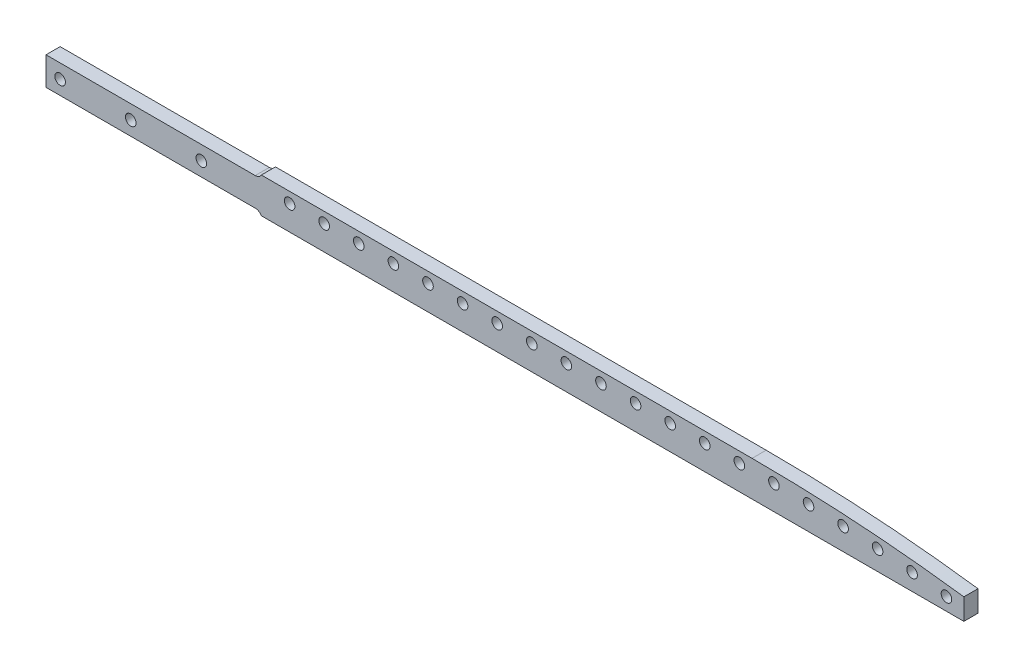
ISO-10303-21;
HEADER;
FILE_DESCRIPTION(('STEP AP214'),'2;1');
FILE_NAME('part.step','',(''),(''),'','','');
FILE_SCHEMA(('AUTOMOTIVE_DESIGN { 1 0 10303 214 1 1 1 1 }'));
ENDSEC;
DATA;
#1=APPLICATION_CONTEXT('core data for automotive mechanical design processes');
#2=APPLICATION_PROTOCOL_DEFINITION('international standard','automotive_design',2000,#1);
#3=PRODUCT_CONTEXT('',#1,'mechanical');
#4=PRODUCT('Part','Part','',(#3));
#5=PRODUCT_RELATED_PRODUCT_CATEGORY('part','',(#4));
#6=PRODUCT_DEFINITION_FORMATION('','',#4);
#7=PRODUCT_DEFINITION_CONTEXT('part definition',#1,'design');
#8=PRODUCT_DEFINITION('design','',#6,#7);
#9=PRODUCT_DEFINITION_SHAPE('','',#8);
#10=(LENGTH_UNIT() NAMED_UNIT(*) SI_UNIT(.MILLI.,.METRE.));
#11=(NAMED_UNIT(*) PLANE_ANGLE_UNIT() SI_UNIT($,.RADIAN.));
#12=(NAMED_UNIT(*) SI_UNIT($,.STERADIAN.) SOLID_ANGLE_UNIT());
#13=UNCERTAINTY_MEASURE_WITH_UNIT(LENGTH_MEASURE(1.E-05),#10,'distance_accuracy_value','');
#14=(GEOMETRIC_REPRESENTATION_CONTEXT(3) GLOBAL_UNCERTAINTY_ASSIGNED_CONTEXT((#13)) GLOBAL_UNIT_ASSIGNED_CONTEXT((#10,
#11,#12)) REPRESENTATION_CONTEXT('',''));
#15=CARTESIAN_POINT('',(0.,0.,0.));
#16=DIRECTION('',(0.,0.,1.));
#17=DIRECTION('',(1.,0.,0.));
#18=AXIS2_PLACEMENT_3D('',#15,#16,#17);
#19=CARTESIAN_POINT('',(-130.,-5.,4.));
#20=DIRECTION('',(1.,0.,0.));
#21=DIRECTION('',(0.,0.,-1.));
#22=AXIS2_PLACEMENT_3D('',#19,#20,#21);
#23=PLANE('',#22);
#24=DIRECTION('',(0.,0.,-1.));
#25=VECTOR('',#24,1.);
#26=CARTESIAN_POINT('',(-130.,-4.00000000000001,4.));
#27=LINE('',#26,#25);
#28=CARTESIAN_POINT('',(-130.,-4.00000000000001,4.));
#29=VERTEX_POINT('',#28);
#30=CARTESIAN_POINT('',(-130.,-4.00000000000001,0.));
#31=VERTEX_POINT('',#30);
#32=EDGE_CURVE('E212',#29,#31,#27,.T.);
#33=ORIENTED_EDGE('',*,*,#32,.F.);
#34=DIRECTION('',(0.,-1.,0.));
#35=VECTOR('',#34,1.);
#36=CARTESIAN_POINT('',(-130.,-5.,4.));
#37=LINE('',#36,#35);
#38=CARTESIAN_POINT('',(-130.,4.00000000000001,4.));
#39=VERTEX_POINT('',#38);
#40=EDGE_CURVE('E159',#39,#29,#37,.T.);
#41=ORIENTED_EDGE('',*,*,#40,.F.);
#42=DIRECTION('',(0.,0.,-1.));
#43=VECTOR('',#42,1.);
#44=CARTESIAN_POINT('',(-130.,4.00000000000001,4.));
#45=LINE('',#44,#43);
#46=CARTESIAN_POINT('',(-130.,4.00000000000001,0.));
#47=VERTEX_POINT('',#46);
#48=EDGE_CURVE('E198',#39,#47,#45,.T.);
#49=ORIENTED_EDGE('',*,*,#48,.T.);
#50=DIRECTION('',(0.,-1.,0.));
#51=VECTOR('',#50,1.);
#52=CARTESIAN_POINT('',(-130.,-5.,0.));
#53=LINE('',#52,#51);
#54=EDGE_CURVE('E175',#47,#31,#53,.T.);
#55=ORIENTED_EDGE('',*,*,#54,.T.);
#56=EDGE_LOOP('',(#33,#41,#49,#55));
#57=FACE_BOUND('',#56,.T.);
#58=ADVANCED_FACE('F68',(#57),#23,.F.);
#59=CARTESIAN_POINT('',(-130.,-5.,4.));
#60=DIRECTION('',(0.,1.,0.));
#61=DIRECTION('',(0.,0.,1.));
#62=AXIS2_PLACEMENT_3D('',#59,#60,#61);
#63=PLANE('',#62);
#64=DIRECTION('',(0.,0.,1.));
#65=VECTOR('',#64,1.);
#66=CARTESIAN_POINT('',(-69.,-5.,4.));
#67=LINE('',#66,#65);
#68=CARTESIAN_POINT('',(-69.,-5.,0.));
#69=VERTEX_POINT('',#68);
#70=CARTESIAN_POINT('',(-69.,-5.,4.));
#71=VERTEX_POINT('',#70);
#72=EDGE_CURVE('E199',#69,#71,#67,.T.);
#73=ORIENTED_EDGE('',*,*,#72,.F.);
#74=DIRECTION('',(1.,0.,0.));
#75=VECTOR('',#74,1.);
#76=CARTESIAN_POINT('',(-130.,-5.,0.));
#77=LINE('',#76,#75);
#78=CARTESIAN_POINT('',(130.,-5.,0.));
#79=VERTEX_POINT('',#78);
#80=EDGE_CURVE('E164',#69,#79,#77,.T.);
#81=ORIENTED_EDGE('',*,*,#80,.T.);
#82=DIRECTION('',(0.,0.,-1.));
#83=VECTOR('',#82,1.);
#84=CARTESIAN_POINT('',(130.,-5.,4.));
#85=LINE('',#84,#83);
#86=CARTESIAN_POINT('',(130.,-5.,4.));
#87=VERTEX_POINT('',#86);
#88=EDGE_CURVE('E169',#87,#79,#85,.T.);
#89=ORIENTED_EDGE('',*,*,#88,.F.);
#90=DIRECTION('',(1.,0.,0.));
#91=VECTOR('',#90,1.);
#92=CARTESIAN_POINT('',(-130.,-5.,4.));
#93=LINE('',#92,#91);
#94=EDGE_CURVE('E162',#71,#87,#93,.T.);
#95=ORIENTED_EDGE('',*,*,#94,.F.);
#96=EDGE_LOOP('',(#73,#81,#89,#95));
#97=FACE_BOUND('',#96,.T.);
#98=ADVANCED_FACE('F364',(#97),#63,.F.);
#99=CARTESIAN_POINT('',(0.,0.,4.));
#100=DIRECTION('',(0.,0.,-1.));
#101=DIRECTION('',(-1.,0.,0.));
#102=AXIS2_PLACEMENT_3D('',#99,#100,#101);
#103=PLANE('',#102);
#104=CARTESIAN_POINT('',(-51.2,2.,4.00000000000002));
#105=DIRECTION('',(0.,0.,1.));
#106=DIRECTION('',(1.,0.,0.));
#107=AXIS2_PLACEMENT_3D('',#104,#105,#106);
#108=CIRCLE('',#107,1.5);
#109=CARTESIAN_POINT('',(-49.7,2.,4.00000000000002));
#110=VERTEX_POINT('',#109);
#111=EDGE_CURVE('E351',#110,#110,#108,.T.);
#112=ORIENTED_EDGE('',*,*,#111,.F.);
#113=EDGE_LOOP('',(#112));
#114=FACE_BOUND('',#113,.T.);
#115=CARTESIAN_POINT('',(-41.4,2.,4.00000000000002));
#116=DIRECTION('',(0.,0.,1.));
#117=DIRECTION('',(1.,0.,0.));
#118=AXIS2_PLACEMENT_3D('',#115,#116,#117);
#119=CIRCLE('',#118,1.5);
#120=CARTESIAN_POINT('',(-39.9,2.,4.00000000000002));
#121=VERTEX_POINT('',#120);
#122=EDGE_CURVE('E345',#121,#121,#119,.T.);
#123=ORIENTED_EDGE('',*,*,#122,.F.);
#124=EDGE_LOOP('',(#123));
#125=FACE_BOUND('',#124,.T.);
#126=CARTESIAN_POINT('',(-31.6,2.,4.00000000000002));
#127=DIRECTION('',(0.,0.,1.));
#128=DIRECTION('',(1.,0.,0.));
#129=AXIS2_PLACEMENT_3D('',#126,#127,#128);
#130=CIRCLE('',#129,1.5);
#131=CARTESIAN_POINT('',(-30.1,2.,4.00000000000002));
#132=VERTEX_POINT('',#131);
#133=EDGE_CURVE('E339',#132,#132,#130,.T.);
#134=ORIENTED_EDGE('',*,*,#133,.F.);
#135=EDGE_LOOP('',(#134));
#136=FACE_BOUND('',#135,.T.);
#137=CARTESIAN_POINT('',(-21.8,2.,4.00000000000002));
#138=DIRECTION('',(0.,0.,1.));
#139=DIRECTION('',(1.,0.,0.));
#140=AXIS2_PLACEMENT_3D('',#137,#138,#139);
#141=CIRCLE('',#140,1.5);
#142=CARTESIAN_POINT('',(-20.3,2.,4.00000000000002));
#143=VERTEX_POINT('',#142);
#144=EDGE_CURVE('E333',#143,#143,#141,.T.);
#145=ORIENTED_EDGE('',*,*,#144,.F.);
#146=EDGE_LOOP('',(#145));
#147=FACE_BOUND('',#146,.T.);
#148=CARTESIAN_POINT('',(-12.,2.,4.00000000000002));
#149=DIRECTION('',(0.,0.,1.));
#150=DIRECTION('',(1.,0.,0.));
#151=AXIS2_PLACEMENT_3D('',#148,#149,#150);
#152=CIRCLE('',#151,1.5);
#153=CARTESIAN_POINT('',(-10.5,2.,4.00000000000002));
#154=VERTEX_POINT('',#153);
#155=EDGE_CURVE('E327',#154,#154,#152,.T.);
#156=ORIENTED_EDGE('',*,*,#155,.F.);
#157=EDGE_LOOP('',(#156));
#158=FACE_BOUND('',#157,.T.);
#159=CARTESIAN_POINT('',(-2.2,2.,4.00000000000002));
#160=DIRECTION('',(0.,0.,1.));
#161=DIRECTION('',(1.,0.,0.));
#162=AXIS2_PLACEMENT_3D('',#159,#160,#161);
#163=CIRCLE('',#162,1.5);
#164=CARTESIAN_POINT('',(-0.700000000000004,2.,4.00000000000002));
#165=VERTEX_POINT('',#164);
#166=EDGE_CURVE('E321',#165,#165,#163,.T.);
#167=ORIENTED_EDGE('',*,*,#166,.F.);
#168=EDGE_LOOP('',(#167));
#169=FACE_BOUND('',#168,.T.);
#170=CARTESIAN_POINT('',(7.6,2.,4.00000000000002));
#171=DIRECTION('',(0.,0.,1.));
#172=DIRECTION('',(1.,0.,0.));
#173=AXIS2_PLACEMENT_3D('',#170,#171,#172);
#174=CIRCLE('',#173,1.5);
#175=CARTESIAN_POINT('',(9.1,2.,4.00000000000002));
#176=VERTEX_POINT('',#175);
#177=EDGE_CURVE('E315',#176,#176,#174,.T.);
#178=ORIENTED_EDGE('',*,*,#177,.F.);
#179=EDGE_LOOP('',(#178));
#180=FACE_BOUND('',#179,.T.);
#181=CARTESIAN_POINT('',(17.4,2.,4.00000000000002));
#182=DIRECTION('',(0.,0.,1.));
#183=DIRECTION('',(1.,0.,0.));
#184=AXIS2_PLACEMENT_3D('',#181,#182,#183);
#185=CIRCLE('',#184,1.5);
#186=CARTESIAN_POINT('',(18.9,2.,4.00000000000002));
#187=VERTEX_POINT('',#186);
#188=EDGE_CURVE('E309',#187,#187,#185,.T.);
#189=ORIENTED_EDGE('',*,*,#188,.F.);
#190=EDGE_LOOP('',(#189));
#191=FACE_BOUND('',#190,.T.);
#192=CARTESIAN_POINT('',(27.2,2.,4.00000000000002));
#193=DIRECTION('',(0.,0.,1.));
#194=DIRECTION('',(1.,0.,0.));
#195=AXIS2_PLACEMENT_3D('',#192,#193,#194);
#196=CIRCLE('',#195,1.5);
#197=CARTESIAN_POINT('',(28.7,2.,4.00000000000002));
#198=VERTEX_POINT('',#197);
#199=EDGE_CURVE('E303',#198,#198,#196,.T.);
#200=ORIENTED_EDGE('',*,*,#199,.F.);
#201=EDGE_LOOP('',(#200));
#202=FACE_BOUND('',#201,.T.);
#203=CARTESIAN_POINT('',(37.,2.,4.00000000000002));
#204=DIRECTION('',(0.,0.,1.));
#205=DIRECTION('',(1.,0.,0.));
#206=AXIS2_PLACEMENT_3D('',#203,#204,#205);
#207=CIRCLE('',#206,1.5);
#208=CARTESIAN_POINT('',(38.5,2.,4.00000000000002));
#209=VERTEX_POINT('',#208);
#210=EDGE_CURVE('E297',#209,#209,#207,.T.);
#211=ORIENTED_EDGE('',*,*,#210,.F.);
#212=EDGE_LOOP('',(#211));
#213=FACE_BOUND('',#212,.T.);
#214=CARTESIAN_POINT('',(46.8,2.,4.00000000000002));
#215=DIRECTION('',(0.,0.,1.));
#216=DIRECTION('',(1.,0.,0.));
#217=AXIS2_PLACEMENT_3D('',#214,#215,#216);
#218=CIRCLE('',#217,1.5);
#219=CARTESIAN_POINT('',(48.3,2.,4.00000000000002));
#220=VERTEX_POINT('',#219);
#221=EDGE_CURVE('E291',#220,#220,#218,.T.);
#222=ORIENTED_EDGE('',*,*,#221,.F.);
#223=EDGE_LOOP('',(#222));
#224=FACE_BOUND('',#223,.T.);
#225=CARTESIAN_POINT('',(56.6,2.,4.00000000000002));
#226=DIRECTION('',(0.,0.,1.));
#227=DIRECTION('',(1.,0.,0.));
#228=AXIS2_PLACEMENT_3D('',#225,#226,#227);
#229=CIRCLE('',#228,1.5);
#230=CARTESIAN_POINT('',(58.1,2.,4.00000000000002));
#231=VERTEX_POINT('',#230);
#232=EDGE_CURVE('E285',#231,#231,#229,.T.);
#233=ORIENTED_EDGE('',*,*,#232,.F.);
#234=EDGE_LOOP('',(#233));
#235=FACE_BOUND('',#234,.T.);
#236=CARTESIAN_POINT('',(66.4,2.,4.00000000000002));
#237=DIRECTION('',(0.,0.,1.));
#238=DIRECTION('',(1.,0.,0.));
#239=AXIS2_PLACEMENT_3D('',#236,#237,#238);
#240=CIRCLE('',#239,1.5);
#241=CARTESIAN_POINT('',(67.9,2.,4.00000000000002));
#242=VERTEX_POINT('',#241);
#243=EDGE_CURVE('E279',#242,#242,#240,.T.);
#244=ORIENTED_EDGE('',*,*,#243,.F.);
#245=EDGE_LOOP('',(#244));
#246=FACE_BOUND('',#245,.T.);
#247=CARTESIAN_POINT('',(76.1998055791387,1.95747854281703,4.00000000000002));
#248=DIRECTION('',(0.,0.,1.));
#249=DIRECTION('',(1.,0.,0.));
#250=AXIS2_PLACEMENT_3D('',#247,#248,#249);
#251=CIRCLE('',#250,1.5);
#252=CARTESIAN_POINT('',(77.6998055791387,1.95747854281703,4.00000000000002));
#253=VERTEX_POINT('',#252);
#254=EDGE_CURVE('E273',#253,#253,#251,.T.);
#255=ORIENTED_EDGE('',*,*,#254,.F.);
#256=EDGE_LOOP('',(#255));
#257=FACE_BOUND('',#256,.T.);
#258=CARTESIAN_POINT('',(85.9966587834908,1.71684372819725,4.00000000000002));
#259=DIRECTION('',(0.,0.,1.));
#260=DIRECTION('',(1.,0.,0.));
#261=AXIS2_PLACEMENT_3D('',#258,#259,#260);
#262=CIRCLE('',#261,1.5);
#263=CARTESIAN_POINT('',(87.4966587834908,1.71684372819725,4.00000000000002));
#264=VERTEX_POINT('',#263);
#265=EDGE_CURVE('E267',#264,#264,#262,.T.);
#266=ORIENTED_EDGE('',*,*,#265,.F.);
#267=EDGE_LOOP('',(#266));
#268=FACE_BOUND('',#267,.T.);
#269=CARTESIAN_POINT('',(95.7859925123198,1.26387246283582,4.00000000000002));
#270=DIRECTION('',(0.,0.,1.));
#271=DIRECTION('',(1.,0.,0.));
#272=AXIS2_PLACEMENT_3D('',#269,#270,#271);
#273=CIRCLE('',#272,1.5);
#274=CARTESIAN_POINT('',(97.2859925123198,1.26387246283582,4.00000000000002));
#275=VERTEX_POINT('',#274);
#276=EDGE_CURVE('E261',#275,#275,#273,.T.);
#277=ORIENTED_EDGE('',*,*,#276,.F.);
#278=EDGE_LOOP('',(#277));
#279=FACE_BOUND('',#278,.T.);
#280=CARTESIAN_POINT('',(105.563205138726,0.598777672843775,4.00000000000002));
#281=DIRECTION('',(0.,0.,1.));
#282=DIRECTION('',(1.,0.,0.));
#283=AXIS2_PLACEMENT_3D('',#280,#281,#282);
#284=CIRCLE('',#283,1.5);
#285=CARTESIAN_POINT('',(107.063205138726,0.598777672843775,4.00000000000002));
#286=VERTEX_POINT('',#285);
#287=EDGE_CURVE('E255',#286,#286,#284,.T.);
#288=ORIENTED_EDGE('',*,*,#287,.F.);
#289=EDGE_LOOP('',(#288));
#290=FACE_BOUND('',#289,.T.);
#291=CARTESIAN_POINT('',(115.323700733521,-0.278128003742439,4.00000000000002));
#292=DIRECTION('',(0.,0.,1.));
#293=DIRECTION('',(1.,0.,0.));
#294=AXIS2_PLACEMENT_3D('',#291,#292,#293);
#295=CIRCLE('',#294,1.5);
#296=CARTESIAN_POINT('',(116.823700733521,-0.278128003742439,4.00000000000002));
#297=VERTEX_POINT('',#296);
#298=EDGE_CURVE('E249',#297,#297,#295,.T.);
#299=ORIENTED_EDGE('',*,*,#298,.F.);
#300=EDGE_LOOP('',(#299));
#301=FACE_BOUND('',#300,.T.);
#302=CARTESIAN_POINT('',(125.062891225612,-1.36643236392081,4.00000000000002));
#303=DIRECTION('',(0.,0.,1.));
#304=DIRECTION('',(1.,0.,0.));
#305=AXIS2_PLACEMENT_3D('',#302,#303,#304);
#306=CIRCLE('',#305,1.5);
#307=CARTESIAN_POINT('',(126.562891225612,-1.36643236392081,4.00000000000002));
#308=VERTEX_POINT('',#307);
#309=EDGE_CURVE('E243',#308,#308,#306,.T.);
#310=ORIENTED_EDGE('',*,*,#309,.F.);
#311=EDGE_LOOP('',(#310));
#312=FACE_BOUND('',#311,.T.);
#313=CARTESIAN_POINT('',(-61.,2.,4.));
#314=DIRECTION('',(0.,0.,1.));
#315=DIRECTION('',(1.,0.,0.));
#316=AXIS2_PLACEMENT_3D('',#313,#314,#315);
#317=CIRCLE('',#316,1.5);
#318=CARTESIAN_POINT('',(-59.5,2.,4.));
#319=VERTEX_POINT('',#318);
#320=EDGE_CURVE('E237',#319,#319,#317,.T.);
#321=ORIENTED_EDGE('',*,*,#320,.F.);
#322=EDGE_LOOP('',(#321));
#323=FACE_BOUND('',#322,.T.);
#324=CARTESIAN_POINT('',(-126.,0.,4.));
#325=DIRECTION('',(0.,0.,1.));
#326=DIRECTION('',(1.,0.,0.));
#327=AXIS2_PLACEMENT_3D('',#324,#325,#326);
#328=CIRCLE('',#327,1.5);
#329=CARTESIAN_POINT('',(-124.5,0.,4.));
#330=VERTEX_POINT('',#329);
#331=EDGE_CURVE('E232',#330,#330,#328,.T.);
#332=ORIENTED_EDGE('',*,*,#331,.F.);
#333=EDGE_LOOP('',(#332));
#334=FACE_BOUND('',#333,.T.);
#335=CARTESIAN_POINT('',(-86.,0.,4.));
#336=DIRECTION('',(0.,0.,1.));
#337=DIRECTION('',(1.,0.,0.));
#338=AXIS2_PLACEMENT_3D('',#335,#336,#337);
#339=CIRCLE('',#338,1.5);
#340=CARTESIAN_POINT('',(-84.5,0.,4.));
#341=VERTEX_POINT('',#340);
#342=EDGE_CURVE('E226',#341,#341,#339,.T.);
#343=ORIENTED_EDGE('',*,*,#342,.F.);
#344=EDGE_LOOP('',(#343));
#345=FACE_BOUND('',#344,.T.);
#346=CARTESIAN_POINT('',(-106.,0.,4.));
#347=DIRECTION('',(0.,0.,1.));
#348=DIRECTION('',(1.,0.,0.));
#349=AXIS2_PLACEMENT_3D('',#346,#347,#348);
#350=CIRCLE('',#349,1.5);
#351=CARTESIAN_POINT('',(-104.5,0.,4.));
#352=VERTEX_POINT('',#351);
#353=EDGE_CURVE('E219',#352,#352,#350,.T.);
#354=ORIENTED_EDGE('',*,*,#353,.F.);
#355=EDGE_LOOP('',(#354));
#356=FACE_BOUND('',#355,.T.);
#357=DIRECTION('',(0.,1.,0.));
#358=VECTOR('',#357,1.);
#359=CARTESIAN_POINT('',(130.,-5.,4.));
#360=LINE('',#359,#358);
#361=CARTESIAN_POINT('',(130.,1.02660675396976,4.));
#362=VERTEX_POINT('',#361);
#363=EDGE_CURVE('E153',#87,#362,#360,.T.);
#364=ORIENTED_EDGE('',*,*,#363,.T.);
#365=CARTESIAN_POINT('',(70.,-450.,4.));
#366=DIRECTION('',(0.,0.,-1.));
#367=DIRECTION('',(1.,0.,0.));
#368=AXIS2_PLACEMENT_3D('',#365,#366,#367);
#369=CIRCLE('',#368,455.);
#370=CARTESIAN_POINT('',(69.9999999999999,5.,4.));
#371=VERTEX_POINT('',#370);
#372=EDGE_CURVE('E140',#371,#362,#369,.T.);
#373=ORIENTED_EDGE('',*,*,#372,.F.);
#374=DIRECTION('',(-1.,0.,0.));
#375=VECTOR('',#374,1.);
#376=CARTESIAN_POINT('',(-130.,5.,4.));
#377=LINE('',#376,#375);
#378=CARTESIAN_POINT('',(-69.,5.,4.));
#379=VERTEX_POINT('',#378);
#380=EDGE_CURVE('E150',#371,#379,#377,.T.);
#381=ORIENTED_EDGE('',*,*,#380,.T.);
#382=CARTESIAN_POINT('',(-70.7320508075689,6.00000000000002,4.));
#383=DIRECTION('',(0.,0.,-1.));
#384=DIRECTION('',(-1.,0.,0.));
#385=AXIS2_PLACEMENT_3D('',#382,#383,#384);
#386=CIRCLE('',#385,2.);
#387=CARTESIAN_POINT('',(-70.7320508075689,4.00000000000002,4.));
#388=VERTEX_POINT('',#387);
#389=EDGE_CURVE('E76',#379,#388,#386,.T.);
#390=ORIENTED_EDGE('',*,*,#389,.T.);
#391=DIRECTION('',(1.,0.,0.));
#392=VECTOR('',#391,1.);
#393=CARTESIAN_POINT('',(-191.,4.,4.));
#394=LINE('',#393,#392);
#395=EDGE_CURVE('E193',#39,#388,#394,.T.);
#396=ORIENTED_EDGE('',*,*,#395,.F.);
#397=ORIENTED_EDGE('',*,*,#40,.T.);
#398=DIRECTION('',(1.,0.,0.));
#399=VECTOR('',#398,1.);
#400=CARTESIAN_POINT('',(-191.,-4.,4.));
#401=LINE('',#400,#399);
#402=CARTESIAN_POINT('',(-70.7320508075689,-4.00000000000002,4.));
#403=VERTEX_POINT('',#402);
#404=EDGE_CURVE('E215',#29,#403,#401,.T.);
#405=ORIENTED_EDGE('',*,*,#404,.T.);
#406=CARTESIAN_POINT('',(-70.7320508075689,-6.00000000000002,4.));
#407=DIRECTION('',(0.,0.,-1.));
#408=DIRECTION('',(-1.,0.,0.));
#409=AXIS2_PLACEMENT_3D('',#406,#407,#408);
#410=CIRCLE('',#409,2.);
#411=EDGE_CURVE('E189',#403,#71,#410,.T.);
#412=ORIENTED_EDGE('',*,*,#411,.T.);
#413=ORIENTED_EDGE('',*,*,#94,.T.);
#414=EDGE_LOOP('',(#364,#373,#381,#390,#396,#397,#405,#412,#413));
#415=FACE_BOUND('',#414,.T.);
#416=ADVANCED_FACE('F149',(#114,#125,#136,#147,#158,#169,#180,#191,#202,#213,#224,#235,#246,
#257,#268,#279,#290,#301,#312,#323,#334,#345,#356,#415),#103,.F.);
#417=CARTESIAN_POINT('',(0.,0.,0.));
#418=DIRECTION('',(0.,0.,-1.));
#419=DIRECTION('',(-1.,0.,0.));
#420=AXIS2_PLACEMENT_3D('',#417,#418,#419);
#421=PLANE('',#420);
#422=CARTESIAN_POINT('',(70.,-450.,0.));
#423=DIRECTION('',(0.,0.,-1.));
#424=DIRECTION('',(1.,0.,0.));
#425=AXIS2_PLACEMENT_3D('',#422,#423,#424);
#426=CIRCLE('',#425,455.);
#427=CARTESIAN_POINT('',(69.9999999999999,5.,0.));
#428=VERTEX_POINT('',#427);
#429=CARTESIAN_POINT('',(130.,1.02660675396976,0.));
#430=VERTEX_POINT('',#429);
#431=EDGE_CURVE('E83',#428,#430,#426,.T.);
#432=ORIENTED_EDGE('',*,*,#431,.T.);
#433=DIRECTION('',(0.,1.,0.));
#434=VECTOR('',#433,1.);
#435=CARTESIAN_POINT('',(130.,-5.,0.));
#436=LINE('',#435,#434);
#437=EDGE_CURVE('E170',#79,#430,#436,.T.);
#438=ORIENTED_EDGE('',*,*,#437,.F.);
#439=ORIENTED_EDGE('',*,*,#80,.F.);
#440=CARTESIAN_POINT('',(-70.7320508075689,-6.00000000000002,0.));
#441=DIRECTION('',(0.,0.,-1.));
#442=DIRECTION('',(-1.,0.,0.));
#443=AXIS2_PLACEMENT_3D('',#440,#441,#442);
#444=CIRCLE('',#443,2.);
#445=CARTESIAN_POINT('',(-70.7320508075689,-4.00000000000002,0.));
#446=VERTEX_POINT('',#445);
#447=EDGE_CURVE('E191',#69,#446,#444,.F.);
#448=ORIENTED_EDGE('',*,*,#447,.T.);
#449=DIRECTION('',(-1.,0.,0.));
#450=VECTOR('',#449,1.);
#451=CARTESIAN_POINT('',(0.,-4.00000000000002,0.));
#452=LINE('',#451,#450);
#453=EDGE_CURVE('E183',#446,#31,#452,.T.);
#454=ORIENTED_EDGE('',*,*,#453,.T.);
#455=ORIENTED_EDGE('',*,*,#54,.F.);
#456=DIRECTION('',(-1.,0.,0.));
#457=VECTOR('',#456,1.);
#458=CARTESIAN_POINT('',(0.,4.00000000000002,0.));
#459=LINE('',#458,#457);
#460=CARTESIAN_POINT('',(-70.7320508075689,4.00000000000002,0.));
#461=VERTEX_POINT('',#460);
#462=EDGE_CURVE('E181',#461,#47,#459,.T.);
#463=ORIENTED_EDGE('',*,*,#462,.F.);
#464=CARTESIAN_POINT('',(-70.7320508075689,6.00000000000002,0.));
#465=DIRECTION('',(0.,0.,-1.));
#466=DIRECTION('',(-1.,0.,0.));
#467=AXIS2_PLACEMENT_3D('',#464,#465,#466);
#468=CIRCLE('',#467,2.);
#469=CARTESIAN_POINT('',(-69.,5.,0.));
#470=VERTEX_POINT('',#469);
#471=EDGE_CURVE('E13',#461,#470,#468,.F.);
#472=ORIENTED_EDGE('',*,*,#471,.T.);
#473=DIRECTION('',(-1.,0.,0.));
#474=VECTOR('',#473,1.);
#475=CARTESIAN_POINT('',(-130.,5.,0.));
#476=LINE('',#475,#474);
#477=EDGE_CURVE('E173',#428,#470,#476,.T.);
#478=ORIENTED_EDGE('',*,*,#477,.F.);
#479=EDGE_LOOP('',(#432,#438,#439,#448,#454,#455,#463,#472,#478));
#480=FACE_BOUND('',#479,.T.);
#481=CARTESIAN_POINT('',(-51.2,2.,0.));
#482=DIRECTION('',(0.,0.,1.));
#483=DIRECTION('',(1.,0.,0.));
#484=AXIS2_PLACEMENT_3D('',#481,#482,#483);
#485=CIRCLE('',#484,1.5);
#486=CARTESIAN_POINT('',(-49.7,2.,0.));
#487=VERTEX_POINT('',#486);
#488=EDGE_CURVE('E240',#487,#487,#485,.T.);
#489=ORIENTED_EDGE('',*,*,#488,.T.);
#490=EDGE_LOOP('',(#489));
#491=FACE_BOUND('',#490,.T.);
#492=CARTESIAN_POINT('',(-41.4,2.,0.));
#493=DIRECTION('',(0.,0.,1.));
#494=DIRECTION('',(1.,0.,0.));
#495=AXIS2_PLACEMENT_3D('',#492,#493,#494);
#496=CIRCLE('',#495,1.5);
#497=CARTESIAN_POINT('',(-39.9,2.,0.));
#498=VERTEX_POINT('',#497);
#499=EDGE_CURVE('E348',#498,#498,#496,.T.);
#500=ORIENTED_EDGE('',*,*,#499,.T.);
#501=EDGE_LOOP('',(#500));
#502=FACE_BOUND('',#501,.T.);
#503=CARTESIAN_POINT('',(-31.6,2.,0.));
#504=DIRECTION('',(0.,0.,1.));
#505=DIRECTION('',(1.,0.,0.));
#506=AXIS2_PLACEMENT_3D('',#503,#504,#505);
#507=CIRCLE('',#506,1.5);
#508=CARTESIAN_POINT('',(-30.1,2.,0.));
#509=VERTEX_POINT('',#508);
#510=EDGE_CURVE('E342',#509,#509,#507,.T.);
#511=ORIENTED_EDGE('',*,*,#510,.T.);
#512=EDGE_LOOP('',(#511));
#513=FACE_BOUND('',#512,.T.);
#514=CARTESIAN_POINT('',(-21.8,2.,0.));
#515=DIRECTION('',(0.,0.,1.));
#516=DIRECTION('',(1.,0.,0.));
#517=AXIS2_PLACEMENT_3D('',#514,#515,#516);
#518=CIRCLE('',#517,1.5);
#519=CARTESIAN_POINT('',(-20.3,2.,0.));
#520=VERTEX_POINT('',#519);
#521=EDGE_CURVE('E336',#520,#520,#518,.T.);
#522=ORIENTED_EDGE('',*,*,#521,.T.);
#523=EDGE_LOOP('',(#522));
#524=FACE_BOUND('',#523,.T.);
#525=CARTESIAN_POINT('',(-12.,2.,0.));
#526=DIRECTION('',(0.,0.,1.));
#527=DIRECTION('',(1.,0.,0.));
#528=AXIS2_PLACEMENT_3D('',#525,#526,#527);
#529=CIRCLE('',#528,1.5);
#530=CARTESIAN_POINT('',(-10.5,2.,0.));
#531=VERTEX_POINT('',#530);
#532=EDGE_CURVE('E330',#531,#531,#529,.T.);
#533=ORIENTED_EDGE('',*,*,#532,.T.);
#534=EDGE_LOOP('',(#533));
#535=FACE_BOUND('',#534,.T.);
#536=CARTESIAN_POINT('',(-2.2,2.,0.));
#537=DIRECTION('',(0.,0.,1.));
#538=DIRECTION('',(1.,0.,0.));
#539=AXIS2_PLACEMENT_3D('',#536,#537,#538);
#540=CIRCLE('',#539,1.5);
#541=CARTESIAN_POINT('',(-0.700000000000004,2.,0.));
#542=VERTEX_POINT('',#541);
#543=EDGE_CURVE('E324',#542,#542,#540,.T.);
#544=ORIENTED_EDGE('',*,*,#543,.T.);
#545=EDGE_LOOP('',(#544));
#546=FACE_BOUND('',#545,.T.);
#547=CARTESIAN_POINT('',(7.6,2.,0.));
#548=DIRECTION('',(0.,0.,1.));
#549=DIRECTION('',(1.,0.,0.));
#550=AXIS2_PLACEMENT_3D('',#547,#548,#549);
#551=CIRCLE('',#550,1.5);
#552=CARTESIAN_POINT('',(9.1,2.,0.));
#553=VERTEX_POINT('',#552);
#554=EDGE_CURVE('E318',#553,#553,#551,.T.);
#555=ORIENTED_EDGE('',*,*,#554,.T.);
#556=EDGE_LOOP('',(#555));
#557=FACE_BOUND('',#556,.T.);
#558=CARTESIAN_POINT('',(17.4,2.,0.));
#559=DIRECTION('',(0.,0.,1.));
#560=DIRECTION('',(1.,0.,0.));
#561=AXIS2_PLACEMENT_3D('',#558,#559,#560);
#562=CIRCLE('',#561,1.5);
#563=CARTESIAN_POINT('',(18.9,2.,0.));
#564=VERTEX_POINT('',#563);
#565=EDGE_CURVE('E312',#564,#564,#562,.T.);
#566=ORIENTED_EDGE('',*,*,#565,.T.);
#567=EDGE_LOOP('',(#566));
#568=FACE_BOUND('',#567,.T.);
#569=CARTESIAN_POINT('',(27.2,2.,0.));
#570=DIRECTION('',(0.,0.,1.));
#571=DIRECTION('',(1.,0.,0.));
#572=AXIS2_PLACEMENT_3D('',#569,#570,#571);
#573=CIRCLE('',#572,1.5);
#574=CARTESIAN_POINT('',(28.7,2.,0.));
#575=VERTEX_POINT('',#574);
#576=EDGE_CURVE('E306',#575,#575,#573,.T.);
#577=ORIENTED_EDGE('',*,*,#576,.T.);
#578=EDGE_LOOP('',(#577));
#579=FACE_BOUND('',#578,.T.);
#580=CARTESIAN_POINT('',(37.,2.,0.));
#581=DIRECTION('',(0.,0.,1.));
#582=DIRECTION('',(1.,0.,0.));
#583=AXIS2_PLACEMENT_3D('',#580,#581,#582);
#584=CIRCLE('',#583,1.5);
#585=CARTESIAN_POINT('',(38.5,2.,0.));
#586=VERTEX_POINT('',#585);
#587=EDGE_CURVE('E300',#586,#586,#584,.T.);
#588=ORIENTED_EDGE('',*,*,#587,.T.);
#589=EDGE_LOOP('',(#588));
#590=FACE_BOUND('',#589,.T.);
#591=CARTESIAN_POINT('',(46.8,2.,0.));
#592=DIRECTION('',(0.,0.,1.));
#593=DIRECTION('',(1.,0.,0.));
#594=AXIS2_PLACEMENT_3D('',#591,#592,#593);
#595=CIRCLE('',#594,1.5);
#596=CARTESIAN_POINT('',(48.3,2.,0.));
#597=VERTEX_POINT('',#596);
#598=EDGE_CURVE('E294',#597,#597,#595,.T.);
#599=ORIENTED_EDGE('',*,*,#598,.T.);
#600=EDGE_LOOP('',(#599));
#601=FACE_BOUND('',#600,.T.);
#602=CARTESIAN_POINT('',(56.6,2.,0.));
#603=DIRECTION('',(0.,0.,1.));
#604=DIRECTION('',(1.,0.,0.));
#605=AXIS2_PLACEMENT_3D('',#602,#603,#604);
#606=CIRCLE('',#605,1.5);
#607=CARTESIAN_POINT('',(58.1,2.,0.));
#608=VERTEX_POINT('',#607);
#609=EDGE_CURVE('E288',#608,#608,#606,.T.);
#610=ORIENTED_EDGE('',*,*,#609,.T.);
#611=EDGE_LOOP('',(#610));
#612=FACE_BOUND('',#611,.T.);
#613=CARTESIAN_POINT('',(66.4,2.,0.));
#614=DIRECTION('',(0.,0.,1.));
#615=DIRECTION('',(1.,0.,0.));
#616=AXIS2_PLACEMENT_3D('',#613,#614,#615);
#617=CIRCLE('',#616,1.5);
#618=CARTESIAN_POINT('',(67.9,2.,0.));
#619=VERTEX_POINT('',#618);
#620=EDGE_CURVE('E282',#619,#619,#617,.T.);
#621=ORIENTED_EDGE('',*,*,#620,.T.);
#622=EDGE_LOOP('',(#621));
#623=FACE_BOUND('',#622,.T.);
#624=CARTESIAN_POINT('',(76.1998055791387,1.95747854281703,0.));
#625=DIRECTION('',(0.,0.,1.));
#626=DIRECTION('',(1.,0.,0.));
#627=AXIS2_PLACEMENT_3D('',#624,#625,#626);
#628=CIRCLE('',#627,1.5);
#629=CARTESIAN_POINT('',(77.6998055791387,1.95747854281703,0.));
#630=VERTEX_POINT('',#629);
#631=EDGE_CURVE('E276',#630,#630,#628,.T.);
#632=ORIENTED_EDGE('',*,*,#631,.T.);
#633=EDGE_LOOP('',(#632));
#634=FACE_BOUND('',#633,.T.);
#635=CARTESIAN_POINT('',(85.9966587834908,1.71684372819725,0.));
#636=DIRECTION('',(0.,0.,1.));
#637=DIRECTION('',(1.,0.,0.));
#638=AXIS2_PLACEMENT_3D('',#635,#636,#637);
#639=CIRCLE('',#638,1.5);
#640=CARTESIAN_POINT('',(87.4966587834908,1.71684372819725,0.));
#641=VERTEX_POINT('',#640);
#642=EDGE_CURVE('E270',#641,#641,#639,.T.);
#643=ORIENTED_EDGE('',*,*,#642,.T.);
#644=EDGE_LOOP('',(#643));
#645=FACE_BOUND('',#644,.T.);
#646=CARTESIAN_POINT('',(95.7859925123198,1.26387246283582,0.));
#647=DIRECTION('',(0.,0.,1.));
#648=DIRECTION('',(1.,0.,0.));
#649=AXIS2_PLACEMENT_3D('',#646,#647,#648);
#650=CIRCLE('',#649,1.5);
#651=CARTESIAN_POINT('',(97.2859925123198,1.26387246283582,0.));
#652=VERTEX_POINT('',#651);
#653=EDGE_CURVE('E264',#652,#652,#650,.T.);
#654=ORIENTED_EDGE('',*,*,#653,.T.);
#655=EDGE_LOOP('',(#654));
#656=FACE_BOUND('',#655,.T.);
#657=CARTESIAN_POINT('',(105.563205138726,0.598777672843775,0.));
#658=DIRECTION('',(0.,0.,1.));
#659=DIRECTION('',(1.,0.,0.));
#660=AXIS2_PLACEMENT_3D('',#657,#658,#659);
#661=CIRCLE('',#660,1.5);
#662=CARTESIAN_POINT('',(107.063205138726,0.598777672843775,0.));
#663=VERTEX_POINT('',#662);
#664=EDGE_CURVE('E258',#663,#663,#661,.T.);
#665=ORIENTED_EDGE('',*,*,#664,.T.);
#666=EDGE_LOOP('',(#665));
#667=FACE_BOUND('',#666,.T.);
#668=CARTESIAN_POINT('',(115.323700733521,-0.278128003742439,0.));
#669=DIRECTION('',(0.,0.,1.));
#670=DIRECTION('',(1.,0.,0.));
#671=AXIS2_PLACEMENT_3D('',#668,#669,#670);
#672=CIRCLE('',#671,1.5);
#673=CARTESIAN_POINT('',(116.823700733521,-0.278128003742439,0.));
#674=VERTEX_POINT('',#673);
#675=EDGE_CURVE('E252',#674,#674,#672,.T.);
#676=ORIENTED_EDGE('',*,*,#675,.T.);
#677=EDGE_LOOP('',(#676));
#678=FACE_BOUND('',#677,.T.);
#679=CARTESIAN_POINT('',(125.062891225612,-1.36643236392081,0.));
#680=DIRECTION('',(0.,0.,1.));
#681=DIRECTION('',(1.,0.,0.));
#682=AXIS2_PLACEMENT_3D('',#679,#680,#681);
#683=CIRCLE('',#682,1.5);
#684=CARTESIAN_POINT('',(126.562891225612,-1.36643236392081,0.));
#685=VERTEX_POINT('',#684);
#686=EDGE_CURVE('E246',#685,#685,#683,.T.);
#687=ORIENTED_EDGE('',*,*,#686,.T.);
#688=EDGE_LOOP('',(#687));
#689=FACE_BOUND('',#688,.T.);
#690=CARTESIAN_POINT('',(-61.,2.,0.));
#691=DIRECTION('',(0.,0.,1.));
#692=DIRECTION('',(1.,0.,0.));
#693=AXIS2_PLACEMENT_3D('',#690,#691,#692);
#694=CIRCLE('',#693,1.5);
#695=CARTESIAN_POINT('',(-59.5,2.,0.));
#696=VERTEX_POINT('',#695);
#697=EDGE_CURVE('E223',#696,#696,#694,.T.);
#698=ORIENTED_EDGE('',*,*,#697,.T.);
#699=EDGE_LOOP('',(#698));
#700=FACE_BOUND('',#699,.T.);
#701=CARTESIAN_POINT('',(-126.,0.,0.));
#702=DIRECTION('',(0.,0.,1.));
#703=DIRECTION('',(1.,0.,0.));
#704=AXIS2_PLACEMENT_3D('',#701,#702,#703);
#705=CIRCLE('',#704,1.5);
#706=CARTESIAN_POINT('',(-124.5,0.,0.));
#707=VERTEX_POINT('',#706);
#708=EDGE_CURVE('E218',#707,#707,#705,.T.);
#709=ORIENTED_EDGE('',*,*,#708,.T.);
#710=EDGE_LOOP('',(#709));
#711=FACE_BOUND('',#710,.T.);
#712=CARTESIAN_POINT('',(-86.,0.,0.));
#713=DIRECTION('',(0.,0.,1.));
#714=DIRECTION('',(1.,0.,0.));
#715=AXIS2_PLACEMENT_3D('',#712,#713,#714);
#716=CIRCLE('',#715,1.5);
#717=CARTESIAN_POINT('',(-84.5,0.,0.));
#718=VERTEX_POINT('',#717);
#719=EDGE_CURVE('E229',#718,#718,#716,.T.);
#720=ORIENTED_EDGE('',*,*,#719,.T.);
#721=EDGE_LOOP('',(#720));
#722=FACE_BOUND('',#721,.T.);
#723=CARTESIAN_POINT('',(-106.,0.,0.));
#724=DIRECTION('',(0.,0.,1.));
#725=DIRECTION('',(1.,0.,0.));
#726=AXIS2_PLACEMENT_3D('',#723,#724,#725);
#727=CIRCLE('',#726,1.5);
#728=CARTESIAN_POINT('',(-104.5,0.,0.));
#729=VERTEX_POINT('',#728);
#730=EDGE_CURVE('E222',#729,#729,#727,.T.);
#731=ORIENTED_EDGE('',*,*,#730,.T.);
#732=EDGE_LOOP('',(#731));
#733=FACE_BOUND('',#732,.T.);
#734=ADVANCED_FACE('F203',(#480,#491,#502,#513,#524,#535,#546,#557,#568,#579,#590,#601,#612,
#623,#634,#645,#656,#667,#678,#689,#700,#711,#722,#733),#421,.T.);
#735=CARTESIAN_POINT('',(130.,-5.,4.));
#736=DIRECTION('',(-1.,0.,0.));
#737=DIRECTION('',(0.,0.,1.));
#738=AXIS2_PLACEMENT_3D('',#735,#736,#737);
#739=PLANE('',#738);
#740=ORIENTED_EDGE('',*,*,#437,.T.);
#741=DIRECTION('',(0.,0.,1.));
#742=VECTOR('',#741,1.);
#743=CARTESIAN_POINT('',(130.,1.02660675396976,0.));
#744=LINE('',#743,#742);
#745=EDGE_CURVE('E145',#430,#362,#744,.T.);
#746=ORIENTED_EDGE('',*,*,#745,.T.);
#747=ORIENTED_EDGE('',*,*,#363,.F.);
#748=ORIENTED_EDGE('',*,*,#88,.T.);
#749=EDGE_LOOP('',(#740,#746,#747,#748));
#750=FACE_BOUND('',#749,.T.);
#751=ADVANCED_FACE('F360',(#750),#739,.F.);
#752=CARTESIAN_POINT('',(-130.,5.,4.));
#753=DIRECTION('',(0.,-1.,0.));
#754=DIRECTION('',(0.,0.,-1.));
#755=AXIS2_PLACEMENT_3D('',#752,#753,#754);
#756=PLANE('',#755);
#757=ORIENTED_EDGE('',*,*,#380,.F.);
#758=DIRECTION('',(0.,0.,1.));
#759=VECTOR('',#758,1.);
#760=CARTESIAN_POINT('',(69.9999999999999,5.,0.));
#761=LINE('',#760,#759);
#762=EDGE_CURVE('E137',#428,#371,#761,.T.);
#763=ORIENTED_EDGE('',*,*,#762,.F.);
#764=ORIENTED_EDGE('',*,*,#477,.T.);
#765=DIRECTION('',(0.,0.,1.));
#766=VECTOR('',#765,1.);
#767=CARTESIAN_POINT('',(-69.,5.,4.));
#768=LINE('',#767,#766);
#769=EDGE_CURVE('E158',#470,#379,#768,.T.);
#770=ORIENTED_EDGE('',*,*,#769,.T.);
#771=EDGE_LOOP('',(#757,#763,#764,#770));
#772=FACE_BOUND('',#771,.T.);
#773=ADVANCED_FACE('F156',(#772),#756,.F.);
#774=CARTESIAN_POINT('',(-191.,4.,0.));
#775=DIRECTION('',(0.,-1.,0.));
#776=DIRECTION('',(1.,0.,0.));
#777=AXIS2_PLACEMENT_3D('',#774,#775,#776);
#778=PLANE('',#777);
#779=ORIENTED_EDGE('',*,*,#395,.T.);
#780=DIRECTION('',(0.,0.,-1.));
#781=VECTOR('',#780,1.);
#782=CARTESIAN_POINT('',(-70.7320508075689,4.00000000000002,0.));
#783=LINE('',#782,#781);
#784=EDGE_CURVE('E91',#388,#461,#783,.T.);
#785=ORIENTED_EDGE('',*,*,#784,.T.);
#786=ORIENTED_EDGE('',*,*,#462,.T.);
#787=ORIENTED_EDGE('',*,*,#48,.F.);
#788=EDGE_LOOP('',(#779,#785,#786,#787));
#789=FACE_BOUND('',#788,.T.);
#790=ADVANCED_FACE('F196',(#789),#778,.F.);
#791=CARTESIAN_POINT('',(-191.,-4.,0.));
#792=DIRECTION('',(0.,-1.,0.));
#793=DIRECTION('',(1.,0.,0.));
#794=AXIS2_PLACEMENT_3D('',#791,#792,#793);
#795=PLANE('',#794);
#796=ORIENTED_EDGE('',*,*,#453,.F.);
#797=DIRECTION('',(0.,0.,1.));
#798=VECTOR('',#797,1.);
#799=CARTESIAN_POINT('',(-70.7320508075689,-4.00000000000002,4.));
#800=LINE('',#799,#798);
#801=EDGE_CURVE('E185',#446,#403,#800,.T.);
#802=ORIENTED_EDGE('',*,*,#801,.T.);
#803=ORIENTED_EDGE('',*,*,#404,.F.);
#804=ORIENTED_EDGE('',*,*,#32,.T.);
#805=EDGE_LOOP('',(#796,#802,#803,#804));
#806=FACE_BOUND('',#805,.T.);
#807=ADVANCED_FACE('F371',(#806),#795,.T.);
#808=CARTESIAN_POINT('',(-106.,0.,0.));
#809=DIRECTION('',(0.,0.,1.));
#810=DIRECTION('',(1.,0.,0.));
#811=AXIS2_PLACEMENT_3D('',#808,#809,#810);
#812=CYLINDRICAL_SURFACE('',#811,1.5);
#813=ORIENTED_EDGE('',*,*,#730,.F.);
#814=EDGE_LOOP('',(#813));
#815=FACE_BOUND('',#814,.T.);
#816=ORIENTED_EDGE('',*,*,#353,.T.);
#817=EDGE_LOOP('',(#816));
#818=FACE_BOUND('',#817,.T.);
#819=ADVANCED_FACE('F373',(#815,#818),#812,.F.);
#820=CARTESIAN_POINT('',(-86.,0.,0.));
#821=DIRECTION('',(0.,0.,1.));
#822=DIRECTION('',(1.,0.,0.));
#823=AXIS2_PLACEMENT_3D('',#820,#821,#822);
#824=CYLINDRICAL_SURFACE('',#823,1.5);
#825=ORIENTED_EDGE('',*,*,#719,.F.);
#826=EDGE_LOOP('',(#825));
#827=FACE_BOUND('',#826,.T.);
#828=ORIENTED_EDGE('',*,*,#342,.T.);
#829=EDGE_LOOP('',(#828));
#830=FACE_BOUND('',#829,.T.);
#831=ADVANCED_FACE('F379',(#827,#830),#824,.F.);
#832=CARTESIAN_POINT('',(-126.,0.,0.));
#833=DIRECTION('',(0.,0.,1.));
#834=DIRECTION('',(1.,0.,0.));
#835=AXIS2_PLACEMENT_3D('',#832,#833,#834);
#836=CYLINDRICAL_SURFACE('',#835,1.5);
#837=ORIENTED_EDGE('',*,*,#708,.F.);
#838=EDGE_LOOP('',(#837));
#839=FACE_BOUND('',#838,.T.);
#840=ORIENTED_EDGE('',*,*,#331,.T.);
#841=EDGE_LOOP('',(#840));
#842=FACE_BOUND('',#841,.T.);
#843=ADVANCED_FACE('F395',(#839,#842),#836,.F.);
#844=CARTESIAN_POINT('',(-70.7320508075689,-6.00000000000002,0.));
#845=DIRECTION('',(0.,0.,-1.));
#846=DIRECTION('',(-1.,0.,0.));
#847=AXIS2_PLACEMENT_3D('',#844,#845,#846);
#848=CYLINDRICAL_SURFACE('',#847,2.);
#849=ORIENTED_EDGE('',*,*,#447,.F.);
#850=ORIENTED_EDGE('',*,*,#72,.T.);
#851=ORIENTED_EDGE('',*,*,#411,.F.);
#852=ORIENTED_EDGE('',*,*,#801,.F.);
#853=EDGE_LOOP('',(#849,#850,#851,#852));
#854=FACE_BOUND('',#853,.T.);
#855=ADVANCED_FACE('F369',(#854),#848,.F.);
#856=CARTESIAN_POINT('',(-70.7320508075689,6.00000000000002,0.));
#857=DIRECTION('',(0.,0.,-1.));
#858=DIRECTION('',(-1.,0.,0.));
#859=AXIS2_PLACEMENT_3D('',#856,#857,#858);
#860=CYLINDRICAL_SURFACE('',#859,2.);
#861=ORIENTED_EDGE('',*,*,#471,.F.);
#862=ORIENTED_EDGE('',*,*,#784,.F.);
#863=ORIENTED_EDGE('',*,*,#389,.F.);
#864=ORIENTED_EDGE('',*,*,#769,.F.);
#865=EDGE_LOOP('',(#861,#862,#863,#864));
#866=FACE_BOUND('',#865,.T.);
#867=ADVANCED_FACE('F70',(#866),#860,.F.);
#868=CARTESIAN_POINT('',(-61.,2.,0.));
#869=DIRECTION('',(0.,0.,1.));
#870=DIRECTION('',(1.,0.,0.));
#871=AXIS2_PLACEMENT_3D('',#868,#869,#870);
#872=CYLINDRICAL_SURFACE('',#871,1.5);
#873=ORIENTED_EDGE('',*,*,#697,.F.);
#874=EDGE_LOOP('',(#873));
#875=FACE_BOUND('',#874,.T.);
#876=ORIENTED_EDGE('',*,*,#320,.T.);
#877=EDGE_LOOP('',(#876));
#878=FACE_BOUND('',#877,.T.);
#879=ADVANCED_FACE('F400',(#875,#878),#872,.F.);
#880=CARTESIAN_POINT('',(125.062891225612,-1.36643236392081,0.));
#881=DIRECTION('',(0.,0.,1.));
#882=DIRECTION('',(1.,0.,0.));
#883=AXIS2_PLACEMENT_3D('',#880,#881,#882);
#884=CYLINDRICAL_SURFACE('',#883,1.5);
#885=ORIENTED_EDGE('',*,*,#686,.F.);
#886=EDGE_LOOP('',(#885));
#887=FACE_BOUND('',#886,.T.);
#888=ORIENTED_EDGE('',*,*,#309,.T.);
#889=EDGE_LOOP('',(#888));
#890=FACE_BOUND('',#889,.T.);
#891=ADVANCED_FACE('F413',(#887,#890),#884,.F.);
#892=CARTESIAN_POINT('',(115.323700733521,-0.278128003742439,0.));
#893=DIRECTION('',(0.,0.,1.));
#894=DIRECTION('',(1.,0.,0.));
#895=AXIS2_PLACEMENT_3D('',#892,#893,#894);
#896=CYLINDRICAL_SURFACE('',#895,1.5);
#897=ORIENTED_EDGE('',*,*,#675,.F.);
#898=EDGE_LOOP('',(#897));
#899=FACE_BOUND('',#898,.T.);
#900=ORIENTED_EDGE('',*,*,#298,.T.);
#901=EDGE_LOOP('',(#900));
#902=FACE_BOUND('',#901,.T.);
#903=ADVANCED_FACE('F417',(#899,#902),#896,.F.);
#904=CARTESIAN_POINT('',(105.563205138726,0.598777672843775,0.));
#905=DIRECTION('',(0.,0.,1.));
#906=DIRECTION('',(1.,0.,0.));
#907=AXIS2_PLACEMENT_3D('',#904,#905,#906);
#908=CYLINDRICAL_SURFACE('',#907,1.5);
#909=ORIENTED_EDGE('',*,*,#664,.F.);
#910=EDGE_LOOP('',(#909));
#911=FACE_BOUND('',#910,.T.);
#912=ORIENTED_EDGE('',*,*,#287,.T.);
#913=EDGE_LOOP('',(#912));
#914=FACE_BOUND('',#913,.T.);
#915=ADVANCED_FACE('F421',(#911,#914),#908,.F.);
#916=CARTESIAN_POINT('',(95.7859925123198,1.26387246283582,0.));
#917=DIRECTION('',(0.,0.,1.));
#918=DIRECTION('',(1.,0.,0.));
#919=AXIS2_PLACEMENT_3D('',#916,#917,#918);
#920=CYLINDRICAL_SURFACE('',#919,1.5);
#921=ORIENTED_EDGE('',*,*,#653,.F.);
#922=EDGE_LOOP('',(#921));
#923=FACE_BOUND('',#922,.T.);
#924=ORIENTED_EDGE('',*,*,#276,.T.);
#925=EDGE_LOOP('',(#924));
#926=FACE_BOUND('',#925,.T.);
#927=ADVANCED_FACE('F425',(#923,#926),#920,.F.);
#928=CARTESIAN_POINT('',(85.9966587834908,1.71684372819725,0.));
#929=DIRECTION('',(0.,0.,1.));
#930=DIRECTION('',(1.,0.,0.));
#931=AXIS2_PLACEMENT_3D('',#928,#929,#930);
#932=CYLINDRICAL_SURFACE('',#931,1.5);
#933=ORIENTED_EDGE('',*,*,#642,.F.);
#934=EDGE_LOOP('',(#933));
#935=FACE_BOUND('',#934,.T.);
#936=ORIENTED_EDGE('',*,*,#265,.T.);
#937=EDGE_LOOP('',(#936));
#938=FACE_BOUND('',#937,.T.);
#939=ADVANCED_FACE('F429',(#935,#938),#932,.F.);
#940=CARTESIAN_POINT('',(76.1998055791387,1.95747854281703,0.));
#941=DIRECTION('',(0.,0.,1.));
#942=DIRECTION('',(1.,0.,0.));
#943=AXIS2_PLACEMENT_3D('',#940,#941,#942);
#944=CYLINDRICAL_SURFACE('',#943,1.5);
#945=ORIENTED_EDGE('',*,*,#631,.F.);
#946=EDGE_LOOP('',(#945));
#947=FACE_BOUND('',#946,.T.);
#948=ORIENTED_EDGE('',*,*,#254,.T.);
#949=EDGE_LOOP('',(#948));
#950=FACE_BOUND('',#949,.T.);
#951=ADVANCED_FACE('F433',(#947,#950),#944,.F.);
#952=CARTESIAN_POINT('',(66.4,2.,0.));
#953=DIRECTION('',(0.,0.,1.));
#954=DIRECTION('',(1.,0.,0.));
#955=AXIS2_PLACEMENT_3D('',#952,#953,#954);
#956=CYLINDRICAL_SURFACE('',#955,1.5);
#957=ORIENTED_EDGE('',*,*,#620,.F.);
#958=EDGE_LOOP('',(#957));
#959=FACE_BOUND('',#958,.T.);
#960=ORIENTED_EDGE('',*,*,#243,.T.);
#961=EDGE_LOOP('',(#960));
#962=FACE_BOUND('',#961,.T.);
#963=ADVANCED_FACE('F437',(#959,#962),#956,.F.);
#964=CARTESIAN_POINT('',(56.6,2.,0.));
#965=DIRECTION('',(0.,0.,1.));
#966=DIRECTION('',(1.,0.,0.));
#967=AXIS2_PLACEMENT_3D('',#964,#965,#966);
#968=CYLINDRICAL_SURFACE('',#967,1.5);
#969=ORIENTED_EDGE('',*,*,#609,.F.);
#970=EDGE_LOOP('',(#969));
#971=FACE_BOUND('',#970,.T.);
#972=ORIENTED_EDGE('',*,*,#232,.T.);
#973=EDGE_LOOP('',(#972));
#974=FACE_BOUND('',#973,.T.);
#975=ADVANCED_FACE('F441',(#971,#974),#968,.F.);
#976=CARTESIAN_POINT('',(46.8,2.,0.));
#977=DIRECTION('',(0.,0.,1.));
#978=DIRECTION('',(1.,0.,0.));
#979=AXIS2_PLACEMENT_3D('',#976,#977,#978);
#980=CYLINDRICAL_SURFACE('',#979,1.5);
#981=ORIENTED_EDGE('',*,*,#598,.F.);
#982=EDGE_LOOP('',(#981));
#983=FACE_BOUND('',#982,.T.);
#984=ORIENTED_EDGE('',*,*,#221,.T.);
#985=EDGE_LOOP('',(#984));
#986=FACE_BOUND('',#985,.T.);
#987=ADVANCED_FACE('F445',(#983,#986),#980,.F.);
#988=CARTESIAN_POINT('',(37.,2.,0.));
#989=DIRECTION('',(0.,0.,1.));
#990=DIRECTION('',(1.,0.,0.));
#991=AXIS2_PLACEMENT_3D('',#988,#989,#990);
#992=CYLINDRICAL_SURFACE('',#991,1.5);
#993=ORIENTED_EDGE('',*,*,#587,.F.);
#994=EDGE_LOOP('',(#993));
#995=FACE_BOUND('',#994,.T.);
#996=ORIENTED_EDGE('',*,*,#210,.T.);
#997=EDGE_LOOP('',(#996));
#998=FACE_BOUND('',#997,.T.);
#999=ADVANCED_FACE('F449',(#995,#998),#992,.F.);
#1000=CARTESIAN_POINT('',(27.2,2.,0.));
#1001=DIRECTION('',(0.,0.,1.));
#1002=DIRECTION('',(1.,0.,0.));
#1003=AXIS2_PLACEMENT_3D('',#1000,#1001,#1002);
#1004=CYLINDRICAL_SURFACE('',#1003,1.5);
#1005=ORIENTED_EDGE('',*,*,#576,.F.);
#1006=EDGE_LOOP('',(#1005));
#1007=FACE_BOUND('',#1006,.T.);
#1008=ORIENTED_EDGE('',*,*,#199,.T.);
#1009=EDGE_LOOP('',(#1008));
#1010=FACE_BOUND('',#1009,.T.);
#1011=ADVANCED_FACE('F453',(#1007,#1010),#1004,.F.);
#1012=CARTESIAN_POINT('',(17.4,2.,0.));
#1013=DIRECTION('',(0.,0.,1.));
#1014=DIRECTION('',(1.,0.,0.));
#1015=AXIS2_PLACEMENT_3D('',#1012,#1013,#1014);
#1016=CYLINDRICAL_SURFACE('',#1015,1.5);
#1017=ORIENTED_EDGE('',*,*,#565,.F.);
#1018=EDGE_LOOP('',(#1017));
#1019=FACE_BOUND('',#1018,.T.);
#1020=ORIENTED_EDGE('',*,*,#188,.T.);
#1021=EDGE_LOOP('',(#1020));
#1022=FACE_BOUND('',#1021,.T.);
#1023=ADVANCED_FACE('F457',(#1019,#1022),#1016,.F.);
#1024=CARTESIAN_POINT('',(7.6,2.,0.));
#1025=DIRECTION('',(0.,0.,1.));
#1026=DIRECTION('',(1.,0.,0.));
#1027=AXIS2_PLACEMENT_3D('',#1024,#1025,#1026);
#1028=CYLINDRICAL_SURFACE('',#1027,1.5);
#1029=ORIENTED_EDGE('',*,*,#554,.F.);
#1030=EDGE_LOOP('',(#1029));
#1031=FACE_BOUND('',#1030,.T.);
#1032=ORIENTED_EDGE('',*,*,#177,.T.);
#1033=EDGE_LOOP('',(#1032));
#1034=FACE_BOUND('',#1033,.T.);
#1035=ADVANCED_FACE('F461',(#1031,#1034),#1028,.F.);
#1036=CARTESIAN_POINT('',(-2.2,2.,0.));
#1037=DIRECTION('',(0.,0.,1.));
#1038=DIRECTION('',(1.,0.,0.));
#1039=AXIS2_PLACEMENT_3D('',#1036,#1037,#1038);
#1040=CYLINDRICAL_SURFACE('',#1039,1.5);
#1041=ORIENTED_EDGE('',*,*,#543,.F.);
#1042=EDGE_LOOP('',(#1041));
#1043=FACE_BOUND('',#1042,.T.);
#1044=ORIENTED_EDGE('',*,*,#166,.T.);
#1045=EDGE_LOOP('',(#1044));
#1046=FACE_BOUND('',#1045,.T.);
#1047=ADVANCED_FACE('F465',(#1043,#1046),#1040,.F.);
#1048=CARTESIAN_POINT('',(-12.,2.,0.));
#1049=DIRECTION('',(0.,0.,1.));
#1050=DIRECTION('',(1.,0.,0.));
#1051=AXIS2_PLACEMENT_3D('',#1048,#1049,#1050);
#1052=CYLINDRICAL_SURFACE('',#1051,1.5);
#1053=ORIENTED_EDGE('',*,*,#532,.F.);
#1054=EDGE_LOOP('',(#1053));
#1055=FACE_BOUND('',#1054,.T.);
#1056=ORIENTED_EDGE('',*,*,#155,.T.);
#1057=EDGE_LOOP('',(#1056));
#1058=FACE_BOUND('',#1057,.T.);
#1059=ADVANCED_FACE('F469',(#1055,#1058),#1052,.F.);
#1060=CARTESIAN_POINT('',(-21.8,2.,0.));
#1061=DIRECTION('',(0.,0.,1.));
#1062=DIRECTION('',(1.,0.,0.));
#1063=AXIS2_PLACEMENT_3D('',#1060,#1061,#1062);
#1064=CYLINDRICAL_SURFACE('',#1063,1.5);
#1065=ORIENTED_EDGE('',*,*,#521,.F.);
#1066=EDGE_LOOP('',(#1065));
#1067=FACE_BOUND('',#1066,.T.);
#1068=ORIENTED_EDGE('',*,*,#144,.T.);
#1069=EDGE_LOOP('',(#1068));
#1070=FACE_BOUND('',#1069,.T.);
#1071=ADVANCED_FACE('F473',(#1067,#1070),#1064,.F.);
#1072=CARTESIAN_POINT('',(-31.6,2.,0.));
#1073=DIRECTION('',(0.,0.,1.));
#1074=DIRECTION('',(1.,0.,0.));
#1075=AXIS2_PLACEMENT_3D('',#1072,#1073,#1074);
#1076=CYLINDRICAL_SURFACE('',#1075,1.5);
#1077=ORIENTED_EDGE('',*,*,#510,.F.);
#1078=EDGE_LOOP('',(#1077));
#1079=FACE_BOUND('',#1078,.T.);
#1080=ORIENTED_EDGE('',*,*,#133,.T.);
#1081=EDGE_LOOP('',(#1080));
#1082=FACE_BOUND('',#1081,.T.);
#1083=ADVANCED_FACE('F477',(#1079,#1082),#1076,.F.);
#1084=CARTESIAN_POINT('',(-41.4,2.,0.));
#1085=DIRECTION('',(0.,0.,1.));
#1086=DIRECTION('',(1.,0.,0.));
#1087=AXIS2_PLACEMENT_3D('',#1084,#1085,#1086);
#1088=CYLINDRICAL_SURFACE('',#1087,1.5);
#1089=ORIENTED_EDGE('',*,*,#499,.F.);
#1090=EDGE_LOOP('',(#1089));
#1091=FACE_BOUND('',#1090,.T.);
#1092=ORIENTED_EDGE('',*,*,#122,.T.);
#1093=EDGE_LOOP('',(#1092));
#1094=FACE_BOUND('',#1093,.T.);
#1095=ADVANCED_FACE('F481',(#1091,#1094),#1088,.F.);
#1096=CARTESIAN_POINT('',(-51.2,2.,0.));
#1097=DIRECTION('',(0.,0.,1.));
#1098=DIRECTION('',(1.,0.,0.));
#1099=AXIS2_PLACEMENT_3D('',#1096,#1097,#1098);
#1100=CYLINDRICAL_SURFACE('',#1099,1.5);
#1101=ORIENTED_EDGE('',*,*,#488,.F.);
#1102=EDGE_LOOP('',(#1101));
#1103=FACE_BOUND('',#1102,.T.);
#1104=ORIENTED_EDGE('',*,*,#111,.T.);
#1105=EDGE_LOOP('',(#1104));
#1106=FACE_BOUND('',#1105,.T.);
#1107=ADVANCED_FACE('F485',(#1103,#1106),#1100,.F.);
#1108=CARTESIAN_POINT('',(70.,-450.,0.));
#1109=DIRECTION('',(0.,0.,1.));
#1110=DIRECTION('',(1.,0.,0.));
#1111=AXIS2_PLACEMENT_3D('',#1108,#1109,#1110);
#1112=CYLINDRICAL_SURFACE('',#1111,455.);
#1113=ORIENTED_EDGE('',*,*,#431,.F.);
#1114=ORIENTED_EDGE('',*,*,#762,.T.);
#1115=ORIENTED_EDGE('',*,*,#372,.T.);
#1116=ORIENTED_EDGE('',*,*,#745,.F.);
#1117=EDGE_LOOP('',(#1113,#1114,#1115,#1116));
#1118=FACE_BOUND('',#1117,.T.);
#1119=ADVANCED_FACE('F139',(#1118),#1112,.T.);
#1120=CLOSED_SHELL('',(#58,#98,#416,#734,#751,#773,#790,#807,#819,#831,#843,#855,#867,#879,#891,
#903,#915,#927,#939,#951,#963,#975,#987,#999,#1011,#1023,#1035,#1047,#1059,#1071,#1083,#1095,
#1107,#1119));
#1121=MANIFOLD_SOLID_BREP('B2',#1120);
#1122=ADVANCED_BREP_SHAPE_REPRESENTATION('',(#18,#1121),#14);
#1123=SHAPE_DEFINITION_REPRESENTATION(#9,#1122);
ENDSEC;
END-ISO-10303-21;
